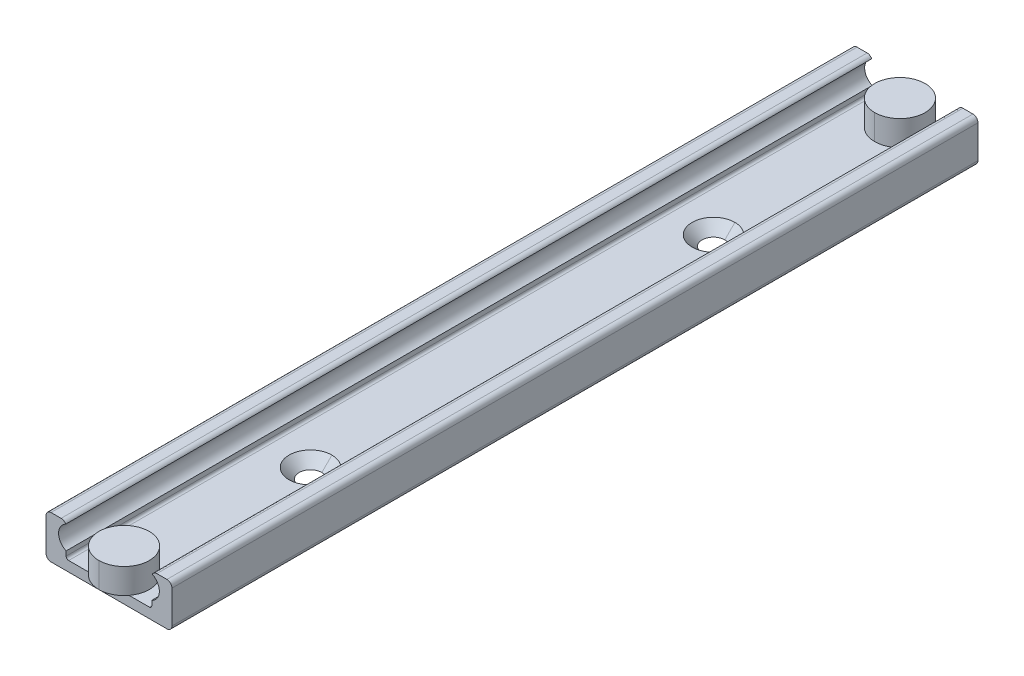
ISO-10303-21;
HEADER;
FILE_DESCRIPTION(('STEP AP214'),'2;1');
FILE_NAME('part.step','',(''),(''),'','','');
FILE_SCHEMA(('AUTOMOTIVE_DESIGN { 1 0 10303 214 1 1 1 1 }'));
ENDSEC;
DATA;
#1=APPLICATION_CONTEXT('core data for automotive mechanical design processes');
#2=APPLICATION_PROTOCOL_DEFINITION('international standard','automotive_design',2000,#1);
#3=PRODUCT_CONTEXT('',#1,'mechanical');
#4=PRODUCT('Part','Part','',(#3));
#5=PRODUCT_RELATED_PRODUCT_CATEGORY('part','',(#4));
#6=PRODUCT_DEFINITION_FORMATION('','',#4);
#7=PRODUCT_DEFINITION_CONTEXT('part definition',#1,'design');
#8=PRODUCT_DEFINITION('design','',#6,#7);
#9=PRODUCT_DEFINITION_SHAPE('','',#8);
#10=(LENGTH_UNIT() NAMED_UNIT(*) SI_UNIT(.MILLI.,.METRE.));
#11=(NAMED_UNIT(*) PLANE_ANGLE_UNIT() SI_UNIT($,.RADIAN.));
#12=(NAMED_UNIT(*) SI_UNIT($,.STERADIAN.) SOLID_ANGLE_UNIT());
#13=UNCERTAINTY_MEASURE_WITH_UNIT(LENGTH_MEASURE(1.E-05),#10,'distance_accuracy_value','');
#14=(GEOMETRIC_REPRESENTATION_CONTEXT(3) GLOBAL_UNCERTAINTY_ASSIGNED_CONTEXT((#13)) GLOBAL_UNIT_ASSIGNED_CONTEXT((#10,
#11,#12)) REPRESENTATION_CONTEXT('',''));
#15=CARTESIAN_POINT('',(0.,0.,0.));
#16=DIRECTION('',(0.,0.,1.));
#17=DIRECTION('',(1.,0.,0.));
#18=AXIS2_PLACEMENT_3D('',#15,#16,#17);
#19=CARTESIAN_POINT('',(-12.5,7.5,160.));
#20=DIRECTION('',(1.,0.,0.));
#21=DIRECTION('',(0.,0.,-1.));
#22=AXIS2_PLACEMENT_3D('',#19,#20,#21);
#23=PLANE('',#22);
#24=DIRECTION('',(0.,-1.,0.));
#25=VECTOR('',#24,1.);
#26=CARTESIAN_POINT('',(-12.5,7.5,0.));
#27=LINE('',#26,#25);
#28=CARTESIAN_POINT('',(-12.5,7.5,0.));
#29=VERTEX_POINT('',#28);
#30=CARTESIAN_POINT('',(-12.5,1.,0.));
#31=VERTEX_POINT('',#30);
#32=EDGE_CURVE('E11',#29,#31,#27,.T.);
#33=ORIENTED_EDGE('',*,*,#32,.T.);
#34=DIRECTION('',(0.,0.,-1.));
#35=VECTOR('',#34,1.);
#36=CARTESIAN_POINT('',(-12.5,1.,160.));
#37=LINE('',#36,#35);
#38=CARTESIAN_POINT('',(-12.5,1.,160.));
#39=VERTEX_POINT('',#38);
#40=EDGE_CURVE('E24',#39,#31,#37,.T.);
#41=ORIENTED_EDGE('',*,*,#40,.F.);
#42=DIRECTION('',(0.,-1.,0.));
#43=VECTOR('',#42,1.);
#44=CARTESIAN_POINT('',(-12.5,7.5,160.));
#45=LINE('',#44,#43);
#46=CARTESIAN_POINT('',(-12.5,7.5,160.));
#47=VERTEX_POINT('',#46);
#48=EDGE_CURVE('E581',#47,#39,#45,.T.);
#49=ORIENTED_EDGE('',*,*,#48,.F.);
#50=DIRECTION('',(0.,0.,-1.));
#51=VECTOR('',#50,1.);
#52=CARTESIAN_POINT('',(-12.5,7.5,160.));
#53=LINE('',#52,#51);
#54=EDGE_CURVE('E577',#47,#29,#53,.T.);
#55=ORIENTED_EDGE('',*,*,#54,.T.);
#56=EDGE_LOOP('',(#33,#41,#49,#55));
#57=FACE_BOUND('',#56,.T.);
#58=ADVANCED_FACE('F16',(#57),#23,.F.);
#59=CARTESIAN_POINT('',(-11.5000000000007,7.50000000000069,160.));
#60=DIRECTION('',(0.,0.,-1.));
#61=DIRECTION('',(0.707106781186161,-0.707106781186934,0.));
#62=AXIS2_PLACEMENT_3D('',#59,#60,#61);
#63=CYLINDRICAL_SURFACE('',#62,0.99999999999931);
#64=CARTESIAN_POINT('',(-11.5000000000007,7.50000000000069,0.));
#65=DIRECTION('',(0.,0.,1.));
#66=DIRECTION('',(1.,0.,0.));
#67=AXIS2_PLACEMENT_3D('',#64,#65,#66);
#68=CIRCLE('',#67,0.99999999999931);
#69=CARTESIAN_POINT('',(-11.5,8.5,0.));
#70=VERTEX_POINT('',#69);
#71=EDGE_CURVE('E572',#70,#29,#68,.T.);
#72=ORIENTED_EDGE('',*,*,#71,.T.);
#73=ORIENTED_EDGE('',*,*,#54,.F.);
#74=CARTESIAN_POINT('',(-11.5000000000007,7.50000000000069,160.));
#75=DIRECTION('',(0.,0.,1.));
#76=DIRECTION('',(1.,0.,0.));
#77=AXIS2_PLACEMENT_3D('',#74,#75,#76);
#78=CIRCLE('',#77,0.99999999999931);
#79=CARTESIAN_POINT('',(-11.5,8.5,160.));
#80=VERTEX_POINT('',#79);
#81=EDGE_CURVE('E567',#80,#47,#78,.T.);
#82=ORIENTED_EDGE('',*,*,#81,.F.);
#83=DIRECTION('',(0.,0.,-1.));
#84=VECTOR('',#83,1.);
#85=CARTESIAN_POINT('',(-11.5,8.5,160.));
#86=LINE('',#85,#84);
#87=EDGE_CURVE('E563',#80,#70,#86,.T.);
#88=ORIENTED_EDGE('',*,*,#87,.T.);
#89=EDGE_LOOP('',(#72,#73,#82,#88));
#90=FACE_BOUND('',#89,.T.);
#91=ADVANCED_FACE('F599',(#90),#63,.T.);
#92=CARTESIAN_POINT('',(-9.5,8.5,160.));
#93=DIRECTION('',(0.,-1.,0.));
#94=DIRECTION('',(0.,0.,-1.));
#95=AXIS2_PLACEMENT_3D('',#92,#93,#94);
#96=PLANE('',#95);
#97=DIRECTION('',(-1.,0.,0.));
#98=VECTOR('',#97,1.);
#99=CARTESIAN_POINT('',(-9.5,8.5,0.));
#100=LINE('',#99,#98);
#101=CARTESIAN_POINT('',(-9.5,8.5,0.));
#102=VERTEX_POINT('',#101);
#103=EDGE_CURVE('E558',#102,#70,#100,.T.);
#104=ORIENTED_EDGE('',*,*,#103,.T.);
#105=ORIENTED_EDGE('',*,*,#87,.F.);
#106=DIRECTION('',(-1.,0.,0.));
#107=VECTOR('',#106,1.);
#108=CARTESIAN_POINT('',(-9.5,8.5,160.));
#109=LINE('',#108,#107);
#110=CARTESIAN_POINT('',(-9.5,8.5,160.));
#111=VERTEX_POINT('',#110);
#112=EDGE_CURVE('E553',#111,#80,#109,.T.);
#113=ORIENTED_EDGE('',*,*,#112,.F.);
#114=DIRECTION('',(0.,0.,-1.));
#115=VECTOR('',#114,1.);
#116=CARTESIAN_POINT('',(-9.5,8.5,160.));
#117=LINE('',#116,#115);
#118=EDGE_CURVE('E549',#111,#102,#117,.T.);
#119=ORIENTED_EDGE('',*,*,#118,.T.);
#120=EDGE_LOOP('',(#104,#105,#113,#119));
#121=FACE_BOUND('',#120,.T.);
#122=ADVANCED_FACE('F677',(#121),#96,.F.);
#123=CARTESIAN_POINT('',(-9.5,7.5,160.));
#124=DIRECTION('',(0.,0.,-1.));
#125=DIRECTION('',(-0.52762171224576,-0.849479445758902,0.));
#126=AXIS2_PLACEMENT_3D('',#123,#124,#125);
#127=CYLINDRICAL_SURFACE('',#126,1.);
#128=CARTESIAN_POINT('',(-9.5,7.5,0.));
#129=DIRECTION('',(0.,0.,1.));
#130=DIRECTION('',(1.,0.,0.));
#131=AXIS2_PLACEMENT_3D('',#128,#129,#130);
#132=CIRCLE('',#131,1.);
#133=CARTESIAN_POINT('',(-8.6035924033162,7.943230662982,0.));
#134=VERTEX_POINT('',#133);
#135=EDGE_CURVE('E544',#134,#102,#132,.T.);
#136=ORIENTED_EDGE('',*,*,#135,.T.);
#137=ORIENTED_EDGE('',*,*,#118,.F.);
#138=CARTESIAN_POINT('',(-9.5,7.5,160.));
#139=DIRECTION('',(0.,0.,1.));
#140=DIRECTION('',(1.,0.,0.));
#141=AXIS2_PLACEMENT_3D('',#138,#139,#140);
#142=CIRCLE('',#141,1.);
#143=CARTESIAN_POINT('',(-8.6035924033162,7.943230662982,160.));
#144=VERTEX_POINT('',#143);
#145=EDGE_CURVE('E539',#144,#111,#142,.T.);
#146=ORIENTED_EDGE('',*,*,#145,.F.);
#147=DIRECTION('',(0.,0.,-1.));
#148=VECTOR('',#147,1.);
#149=CARTESIAN_POINT('',(-8.6035924033162,7.943230662982,160.));
#150=LINE('',#149,#148);
#151=EDGE_CURVE('E535',#144,#134,#150,.T.);
#152=ORIENTED_EDGE('',*,*,#151,.T.);
#153=EDGE_LOOP('',(#136,#137,#146,#152));
#154=FACE_BOUND('',#153,.T.);
#155=ADVANCED_FACE('F681',(#154),#127,.T.);
#156=CARTESIAN_POINT('',(-7.5,5.7,160.));
#157=DIRECTION('',(0.,0.,-1.));
#158=DIRECTION('',(0.999739148561569,0.022839326465319,0.));
#159=AXIS2_PLACEMENT_3D('',#156,#157,#158);
#160=CYLINDRICAL_SURFACE('',#159,2.5);
#161=CARTESIAN_POINT('',(-7.5,5.7,0.));
#162=DIRECTION('',(0.,0.,1.));
#163=DIRECTION('',(1.,0.,0.));
#164=AXIS2_PLACEMENT_3D('',#161,#162,#163);
#165=CIRCLE('',#164,2.5);
#166=CARTESIAN_POINT('',(-8.5,3.4087121525221,0.));
#167=VERTEX_POINT('',#166);
#168=EDGE_CURVE('E530',#134,#167,#165,.T.);
#169=ORIENTED_EDGE('',*,*,#168,.F.);
#170=ORIENTED_EDGE('',*,*,#151,.F.);
#171=CARTESIAN_POINT('',(-7.5,5.7,160.));
#172=DIRECTION('',(0.,0.,1.));
#173=DIRECTION('',(1.,0.,0.));
#174=AXIS2_PLACEMENT_3D('',#171,#172,#173);
#175=CIRCLE('',#174,2.5);
#176=CARTESIAN_POINT('',(-8.5,3.4087121525221,160.));
#177=VERTEX_POINT('',#176);
#178=EDGE_CURVE('E526',#144,#177,#175,.T.);
#179=ORIENTED_EDGE('',*,*,#178,.T.);
#180=DIRECTION('',(0.,0.,-1.));
#181=VECTOR('',#180,1.);
#182=CARTESIAN_POINT('',(-8.5,3.4087121525221,160.));
#183=LINE('',#182,#181);
#184=EDGE_CURVE('E522',#177,#167,#183,.T.);
#185=ORIENTED_EDGE('',*,*,#184,.T.);
#186=EDGE_LOOP('',(#169,#170,#179,#185));
#187=FACE_BOUND('',#186,.T.);
#188=ADVANCED_FACE('F687',(#187),#160,.F.);
#189=CARTESIAN_POINT('',(-8.5,2.5,160.));
#190=DIRECTION('',(-1.,0.,0.));
#191=DIRECTION('',(0.,0.,1.));
#192=AXIS2_PLACEMENT_3D('',#189,#190,#191);
#193=PLANE('',#192);
#194=DIRECTION('',(0.,1.,0.));
#195=VECTOR('',#194,1.);
#196=CARTESIAN_POINT('',(-8.5,2.5,0.));
#197=LINE('',#196,#195);
#198=CARTESIAN_POINT('',(-8.5,2.5,0.));
#199=VERTEX_POINT('',#198);
#200=EDGE_CURVE('E517',#199,#167,#197,.T.);
#201=ORIENTED_EDGE('',*,*,#200,.T.);
#202=ORIENTED_EDGE('',*,*,#184,.F.);
#203=DIRECTION('',(0.,1.,0.));
#204=VECTOR('',#203,1.);
#205=CARTESIAN_POINT('',(-8.5,2.5,160.));
#206=LINE('',#205,#204);
#207=CARTESIAN_POINT('',(-8.5,2.5,160.));
#208=VERTEX_POINT('',#207);
#209=EDGE_CURVE('E512',#208,#177,#206,.T.);
#210=ORIENTED_EDGE('',*,*,#209,.F.);
#211=DIRECTION('',(0.,0.,-1.));
#212=VECTOR('',#211,1.);
#213=CARTESIAN_POINT('',(-8.5,2.5,160.));
#214=LINE('',#213,#212);
#215=EDGE_CURVE('E508',#208,#199,#214,.T.);
#216=ORIENTED_EDGE('',*,*,#215,.T.);
#217=EDGE_LOOP('',(#201,#202,#210,#216));
#218=FACE_BOUND('',#217,.T.);
#219=ADVANCED_FACE('F691',(#218),#193,.F.);
#220=CARTESIAN_POINT('',(-8.00000000000009,2.49999999999991,160.));
#221=DIRECTION('',(0.,0.,-1.));
#222=DIRECTION('',(0.707106781186547,0.707106781186548,0.));
#223=AXIS2_PLACEMENT_3D('',#220,#221,#222);
#224=CYLINDRICAL_SURFACE('',#223,0.499999999999911);
#225=CARTESIAN_POINT('',(-8.00000000000009,2.49999999999991,0.));
#226=DIRECTION('',(0.,0.,1.));
#227=DIRECTION('',(1.,0.,0.));
#228=AXIS2_PLACEMENT_3D('',#225,#226,#227);
#229=CIRCLE('',#228,0.499999999999911);
#230=CARTESIAN_POINT('',(-8.,2.,0.));
#231=VERTEX_POINT('',#230);
#232=EDGE_CURVE('E503',#199,#231,#229,.T.);
#233=ORIENTED_EDGE('',*,*,#232,.F.);
#234=ORIENTED_EDGE('',*,*,#215,.F.);
#235=CARTESIAN_POINT('',(-8.00000000000009,2.49999999999991,160.));
#236=DIRECTION('',(0.,0.,1.));
#237=DIRECTION('',(1.,0.,0.));
#238=AXIS2_PLACEMENT_3D('',#235,#236,#237);
#239=CIRCLE('',#238,0.499999999999911);
#240=CARTESIAN_POINT('',(-8.,2.,160.));
#241=VERTEX_POINT('',#240);
#242=EDGE_CURVE('E499',#208,#241,#239,.T.);
#243=ORIENTED_EDGE('',*,*,#242,.T.);
#244=DIRECTION('',(0.,0.,-1.));
#245=VECTOR('',#244,1.);
#246=CARTESIAN_POINT('',(-8.,2.,160.));
#247=LINE('',#246,#245);
#248=EDGE_CURVE('E495',#241,#231,#247,.T.);
#249=ORIENTED_EDGE('',*,*,#248,.T.);
#250=EDGE_LOOP('',(#233,#234,#243,#249));
#251=FACE_BOUND('',#250,.T.);
#252=ADVANCED_FACE('F695',(#251),#224,.F.);
#253=CARTESIAN_POINT('',(8.,2.,160.));
#254=DIRECTION('',(0.,-1.,0.));
#255=DIRECTION('',(0.,0.,-1.));
#256=AXIS2_PLACEMENT_3D('',#253,#254,#255);
#257=PLANE('',#256);
#258=CARTESIAN_POINT('',(0.,2.,157.));
#259=DIRECTION('',(0.,1.,0.));
#260=DIRECTION('',(1.,0.,0.));
#261=AXIS2_PLACEMENT_3D('',#258,#259,#260);
#262=CIRCLE('',#261,5.);
#263=CARTESIAN_POINT('',(0.,2.,152.));
#264=VERTEX_POINT('',#263);
#265=CARTESIAN_POINT('',(-4.,2.,160.));
#266=VERTEX_POINT('',#265);
#267=EDGE_CURVE('E490',#264,#266,#262,.T.);
#268=ORIENTED_EDGE('',*,*,#267,.F.);
#269=CARTESIAN_POINT('',(0.,2.,157.));
#270=DIRECTION('',(0.,1.,0.));
#271=DIRECTION('',(1.,0.,0.));
#272=AXIS2_PLACEMENT_3D('',#269,#270,#271);
#273=CIRCLE('',#272,5.);
#274=CARTESIAN_POINT('',(4.,2.,160.));
#275=VERTEX_POINT('',#274);
#276=EDGE_CURVE('E485',#275,#264,#273,.T.);
#277=ORIENTED_EDGE('',*,*,#276,.F.);
#278=DIRECTION('',(-1.,0.,0.));
#279=VECTOR('',#278,1.);
#280=CARTESIAN_POINT('',(8.,2.,160.));
#281=LINE('',#280,#279);
#282=CARTESIAN_POINT('',(8.,2.,160.));
#283=VERTEX_POINT('',#282);
#284=EDGE_CURVE('E480',#283,#275,#281,.T.);
#285=ORIENTED_EDGE('',*,*,#284,.F.);
#286=DIRECTION('',(0.,0.,-1.));
#287=VECTOR('',#286,1.);
#288=CARTESIAN_POINT('',(8.,2.,160.));
#289=LINE('',#288,#287);
#290=CARTESIAN_POINT('',(8.,2.,0.));
#291=VERTEX_POINT('',#290);
#292=EDGE_CURVE('E476',#283,#291,#289,.T.);
#293=ORIENTED_EDGE('',*,*,#292,.T.);
#294=DIRECTION('',(-1.,0.,0.));
#295=VECTOR('',#294,1.);
#296=CARTESIAN_POINT('',(8.,2.,0.));
#297=LINE('',#296,#295);
#298=CARTESIAN_POINT('',(4.,2.,0.));
#299=VERTEX_POINT('',#298);
#300=EDGE_CURVE('E472',#291,#299,#297,.T.);
#301=ORIENTED_EDGE('',*,*,#300,.T.);
#302=CARTESIAN_POINT('',(0.,2.,3.));
#303=DIRECTION('',(0.,1.,0.));
#304=DIRECTION('',(1.,0.,0.));
#305=AXIS2_PLACEMENT_3D('',#302,#303,#304);
#306=CIRCLE('',#305,5.);
#307=CARTESIAN_POINT('',(0.,2.,8.));
#308=VERTEX_POINT('',#307);
#309=EDGE_CURVE('E468',#308,#299,#306,.T.);
#310=ORIENTED_EDGE('',*,*,#309,.F.);
#311=CARTESIAN_POINT('',(0.,2.,3.));
#312=DIRECTION('',(0.,1.,0.));
#313=DIRECTION('',(1.,0.,0.));
#314=AXIS2_PLACEMENT_3D('',#311,#312,#313);
#315=CIRCLE('',#314,5.);
#316=CARTESIAN_POINT('',(-4.,2.,0.));
#317=VERTEX_POINT('',#316);
#318=EDGE_CURVE('E214',#317,#308,#315,.T.);
#319=ORIENTED_EDGE('',*,*,#318,.F.);
#320=DIRECTION('',(-1.,0.,0.));
#321=VECTOR('',#320,1.);
#322=CARTESIAN_POINT('',(8.,2.,0.));
#323=LINE('',#322,#321);
#324=EDGE_CURVE('E460',#317,#231,#323,.T.);
#325=ORIENTED_EDGE('',*,*,#324,.T.);
#326=ORIENTED_EDGE('',*,*,#248,.F.);
#327=DIRECTION('',(-1.,0.,0.));
#328=VECTOR('',#327,1.);
#329=CARTESIAN_POINT('',(8.,2.,160.));
#330=LINE('',#329,#328);
#331=EDGE_CURVE('E455',#266,#241,#330,.T.);
#332=ORIENTED_EDGE('',*,*,#331,.F.);
#333=EDGE_LOOP('',(#268,#277,#285,#293,#301,#310,#319,#325,#326,#332));
#334=FACE_BOUND('',#333,.T.);
#335=CARTESIAN_POINT('',(0.,2.,120.));
#336=DIRECTION('',(0.,-1.,0.));
#337=DIRECTION('',(0.,0.,-1.));
#338=AXIS2_PLACEMENT_3D('',#335,#336,#337);
#339=CIRCLE('',#338,4.25);
#340=CARTESIAN_POINT('',(0.,2.,115.75));
#341=VERTEX_POINT('',#340);
#342=CARTESIAN_POINT('',(0.,2.,124.25));
#343=VERTEX_POINT('',#342);
#344=EDGE_CURVE('E451',#341,#343,#339,.T.);
#345=ORIENTED_EDGE('',*,*,#344,.T.);
#346=CARTESIAN_POINT('',(0.,2.,120.));
#347=DIRECTION('',(0.,-1.,0.));
#348=DIRECTION('',(0.,0.,-1.));
#349=AXIS2_PLACEMENT_3D('',#346,#347,#348);
#350=CIRCLE('',#349,4.25);
#351=EDGE_CURVE('E447',#343,#341,#350,.T.);
#352=ORIENTED_EDGE('',*,*,#351,.T.);
#353=EDGE_LOOP('',(#345,#352));
#354=FACE_BOUND('',#353,.T.);
#355=CARTESIAN_POINT('',(0.,2.,40.));
#356=DIRECTION('',(0.,-1.,0.));
#357=DIRECTION('',(0.,0.,-1.));
#358=AXIS2_PLACEMENT_3D('',#355,#356,#357);
#359=CIRCLE('',#358,4.25);
#360=CARTESIAN_POINT('',(0.,2.,35.75));
#361=VERTEX_POINT('',#360);
#362=CARTESIAN_POINT('',(0.,2.,44.25));
#363=VERTEX_POINT('',#362);
#364=EDGE_CURVE('E443',#361,#363,#359,.T.);
#365=ORIENTED_EDGE('',*,*,#364,.T.);
#366=CARTESIAN_POINT('',(0.,2.,40.));
#367=DIRECTION('',(0.,-1.,0.));
#368=DIRECTION('',(0.,0.,-1.));
#369=AXIS2_PLACEMENT_3D('',#366,#367,#368);
#370=CIRCLE('',#369,4.25);
#371=EDGE_CURVE('E439',#363,#361,#370,.T.);
#372=ORIENTED_EDGE('',*,*,#371,.T.);
#373=EDGE_LOOP('',(#365,#372));
#374=FACE_BOUND('',#373,.T.);
#375=ADVANCED_FACE('F647',(#334,#354,#374),#257,.F.);
#376=CARTESIAN_POINT('',(0.,2.,40.));
#377=DIRECTION('',(0.,1.,0.));
#378=DIRECTION('',(1.,0.,0.));
#379=AXIS2_PLACEMENT_3D('',#376,#377,#378);
#380=CONICAL_SURFACE('',#379,4.25,0.785398163397448);
#381=DIRECTION('',(0.,0.707106781186547,-0.707106781186548));
#382=VECTOR('',#381,1.);
#383=CARTESIAN_POINT('',(0.,0.,37.75));
#384=LINE('',#383,#382);
#385=CARTESIAN_POINT('',(0.,0.,37.75));
#386=VERTEX_POINT('',#385);
#387=EDGE_CURVE('E434',#386,#361,#384,.T.);
#388=ORIENTED_EDGE('',*,*,#387,.T.);
#389=ORIENTED_EDGE('',*,*,#371,.F.);
#390=DIRECTION('',(0.,0.707106781186547,0.707106781186548));
#391=VECTOR('',#390,1.);
#392=CARTESIAN_POINT('',(0.,0.,42.25));
#393=LINE('',#392,#391);
#394=CARTESIAN_POINT('',(0.,0.,42.25));
#395=VERTEX_POINT('',#394);
#396=EDGE_CURVE('E429',#395,#363,#393,.T.);
#397=ORIENTED_EDGE('',*,*,#396,.F.);
#398=CARTESIAN_POINT('',(0.,0.,40.));
#399=DIRECTION('',(0.,-1.,0.));
#400=DIRECTION('',(0.,0.,-1.));
#401=AXIS2_PLACEMENT_3D('',#398,#399,#400);
#402=CIRCLE('',#401,2.25);
#403=EDGE_CURVE('E425',#395,#386,#402,.T.);
#404=ORIENTED_EDGE('',*,*,#403,.T.);
#405=EDGE_LOOP('',(#388,#389,#397,#404));
#406=FACE_BOUND('',#405,.T.);
#407=ADVANCED_FACE('F702',(#406),#380,.F.);
#408=CARTESIAN_POINT('',(-11.5,0.,160.));
#409=DIRECTION('',(0.,1.,0.));
#410=DIRECTION('',(0.,0.,1.));
#411=AXIS2_PLACEMENT_3D('',#408,#409,#410);
#412=PLANE('',#411);
#413=CARTESIAN_POINT('',(0.,0.,120.));
#414=DIRECTION('',(0.,-1.,0.));
#415=DIRECTION('',(0.,0.,-1.));
#416=AXIS2_PLACEMENT_3D('',#413,#414,#415);
#417=CIRCLE('',#416,2.25);
#418=CARTESIAN_POINT('',(0.,0.,122.25));
#419=VERTEX_POINT('',#418);
#420=CARTESIAN_POINT('',(0.,0.,117.75));
#421=VERTEX_POINT('',#420);
#422=EDGE_CURVE('E420',#419,#421,#417,.T.);
#423=ORIENTED_EDGE('',*,*,#422,.F.);
#424=CARTESIAN_POINT('',(0.,0.,120.));
#425=DIRECTION('',(0.,-1.,0.));
#426=DIRECTION('',(0.,0.,-1.));
#427=AXIS2_PLACEMENT_3D('',#424,#425,#426);
#428=CIRCLE('',#427,2.25);
#429=EDGE_CURVE('E415',#421,#419,#428,.T.);
#430=ORIENTED_EDGE('',*,*,#429,.F.);
#431=EDGE_LOOP('',(#423,#430));
#432=FACE_BOUND('',#431,.T.);
#433=ORIENTED_EDGE('',*,*,#403,.F.);
#434=CARTESIAN_POINT('',(0.,0.,40.));
#435=DIRECTION('',(0.,-1.,0.));
#436=DIRECTION('',(0.,0.,-1.));
#437=AXIS2_PLACEMENT_3D('',#434,#435,#436);
#438=CIRCLE('',#437,2.25);
#439=EDGE_CURVE('E410',#386,#395,#438,.T.);
#440=ORIENTED_EDGE('',*,*,#439,.F.);
#441=EDGE_LOOP('',(#433,#440));
#442=FACE_BOUND('',#441,.T.);
#443=DIRECTION('',(1.,0.,0.));
#444=VECTOR('',#443,1.);
#445=CARTESIAN_POINT('',(-11.5,0.,0.));
#446=LINE('',#445,#444);
#447=CARTESIAN_POINT('',(-11.5,0.,0.));
#448=VERTEX_POINT('',#447);
#449=CARTESIAN_POINT('',(11.5,0.,0.));
#450=VERTEX_POINT('',#449);
#451=EDGE_CURVE('E406',#448,#450,#446,.T.);
#452=ORIENTED_EDGE('',*,*,#451,.T.);
#453=DIRECTION('',(0.,0.,-1.));
#454=VECTOR('',#453,1.);
#455=CARTESIAN_POINT('',(11.5,0.,160.));
#456=LINE('',#455,#454);
#457=CARTESIAN_POINT('',(11.5,0.,160.));
#458=VERTEX_POINT('',#457);
#459=EDGE_CURVE('E401',#458,#450,#456,.T.);
#460=ORIENTED_EDGE('',*,*,#459,.F.);
#461=DIRECTION('',(1.,0.,0.));
#462=VECTOR('',#461,1.);
#463=CARTESIAN_POINT('',(-11.5,0.,160.));
#464=LINE('',#463,#462);
#465=CARTESIAN_POINT('',(-11.5,0.,160.));
#466=VERTEX_POINT('',#465);
#467=EDGE_CURVE('E396',#466,#458,#464,.T.);
#468=ORIENTED_EDGE('',*,*,#467,.F.);
#469=DIRECTION('',(0.,0.,-1.));
#470=VECTOR('',#469,1.);
#471=CARTESIAN_POINT('',(-11.5,0.,160.));
#472=LINE('',#471,#470);
#473=EDGE_CURVE('E392',#466,#448,#472,.T.);
#474=ORIENTED_EDGE('',*,*,#473,.T.);
#475=EDGE_LOOP('',(#452,#460,#468,#474));
#476=FACE_BOUND('',#475,.T.);
#477=ADVANCED_FACE('F607',(#432,#442,#476),#412,.F.);
#478=CARTESIAN_POINT('',(-11.5000000000008,0.999999999999223,160.));
#479=DIRECTION('',(0.,0.,-1.));
#480=DIRECTION('',(0.707106781186115,0.70710678118698,0.));
#481=AXIS2_PLACEMENT_3D('',#478,#479,#480);
#482=CYLINDRICAL_SURFACE('',#481,0.999999999999222);
#483=CARTESIAN_POINT('',(-11.5000000000008,0.999999999999223,0.));
#484=DIRECTION('',(0.,0.,1.));
#485=DIRECTION('',(1.,0.,0.));
#486=AXIS2_PLACEMENT_3D('',#483,#484,#485);
#487=CIRCLE('',#486,0.999999999999222);
#488=EDGE_CURVE('E387',#31,#448,#487,.T.);
#489=ORIENTED_EDGE('',*,*,#488,.T.);
#490=ORIENTED_EDGE('',*,*,#473,.F.);
#491=CARTESIAN_POINT('',(-11.5000000000008,0.999999999999223,160.));
#492=DIRECTION('',(0.,0.,1.));
#493=DIRECTION('',(1.,0.,0.));
#494=AXIS2_PLACEMENT_3D('',#491,#492,#493);
#495=CIRCLE('',#494,0.999999999999222);
#496=EDGE_CURVE('E382',#39,#466,#495,.T.);
#497=ORIENTED_EDGE('',*,*,#496,.F.);
#498=ORIENTED_EDGE('',*,*,#40,.T.);
#499=EDGE_LOOP('',(#489,#490,#497,#498));
#500=FACE_BOUND('',#499,.T.);
#501=ADVANCED_FACE('F591',(#500),#482,.T.);
#502=CARTESIAN_POINT('',(-11.5000000000008,0.999999999999223,160.));
#503=DIRECTION('',(0.,0.,1.));
#504=DIRECTION('',(1.,0.,0.));
#505=AXIS2_PLACEMENT_3D('',#502,#503,#504);
#506=PLANE('',#505);
#507=ORIENTED_EDGE('',*,*,#48,.T.);
#508=ORIENTED_EDGE('',*,*,#496,.T.);
#509=ORIENTED_EDGE('',*,*,#467,.T.);
#510=CARTESIAN_POINT('',(11.5000000000008,0.999999999999223,160.));
#511=DIRECTION('',(0.,0.,1.));
#512=DIRECTION('',(1.,0.,0.));
#513=AXIS2_PLACEMENT_3D('',#510,#511,#512);
#514=CIRCLE('',#513,0.999999999999223);
#515=CARTESIAN_POINT('',(12.5,1.,160.));
#516=VERTEX_POINT('',#515);
#517=EDGE_CURVE('E378',#458,#516,#514,.T.);
#518=ORIENTED_EDGE('',*,*,#517,.T.);
#519=DIRECTION('',(0.,1.,0.));
#520=VECTOR('',#519,1.);
#521=CARTESIAN_POINT('',(12.5,1.,160.));
#522=LINE('',#521,#520);
#523=CARTESIAN_POINT('',(12.5,7.5,160.));
#524=VERTEX_POINT('',#523);
#525=EDGE_CURVE('E374',#516,#524,#522,.T.);
#526=ORIENTED_EDGE('',*,*,#525,.T.);
#527=CARTESIAN_POINT('',(11.5000000000007,7.50000000000069,160.));
#528=DIRECTION('',(0.,0.,1.));
#529=DIRECTION('',(1.,0.,0.));
#530=AXIS2_PLACEMENT_3D('',#527,#528,#529);
#531=CIRCLE('',#530,0.999999999999309);
#532=CARTESIAN_POINT('',(11.5,8.5,160.));
#533=VERTEX_POINT('',#532);
#534=EDGE_CURVE('E370',#524,#533,#531,.T.);
#535=ORIENTED_EDGE('',*,*,#534,.T.);
#536=DIRECTION('',(-1.,0.,0.));
#537=VECTOR('',#536,1.);
#538=CARTESIAN_POINT('',(11.5,8.5,160.));
#539=LINE('',#538,#537);
#540=CARTESIAN_POINT('',(9.5,8.5,160.));
#541=VERTEX_POINT('',#540);
#542=EDGE_CURVE('E366',#533,#541,#539,.T.);
#543=ORIENTED_EDGE('',*,*,#542,.T.);
#544=CARTESIAN_POINT('',(9.5,7.5,160.));
#545=DIRECTION('',(0.,0.,1.));
#546=DIRECTION('',(1.,0.,0.));
#547=AXIS2_PLACEMENT_3D('',#544,#545,#546);
#548=CIRCLE('',#547,1.);
#549=CARTESIAN_POINT('',(8.6035924033162,7.943230662982,160.));
#550=VERTEX_POINT('',#549);
#551=EDGE_CURVE('E362',#541,#550,#548,.T.);
#552=ORIENTED_EDGE('',*,*,#551,.T.);
#553=CARTESIAN_POINT('',(7.5,5.7,160.));
#554=DIRECTION('',(0.,0.,1.));
#555=DIRECTION('',(1.,0.,0.));
#556=AXIS2_PLACEMENT_3D('',#553,#554,#555);
#557=CIRCLE('',#556,2.5);
#558=CARTESIAN_POINT('',(8.5,3.4087121525221,160.));
#559=VERTEX_POINT('',#558);
#560=EDGE_CURVE('E357',#559,#550,#557,.T.);
#561=ORIENTED_EDGE('',*,*,#560,.F.);
#562=DIRECTION('',(0.,-1.,0.));
#563=VECTOR('',#562,1.);
#564=CARTESIAN_POINT('',(8.5,3.4087121525221,160.));
#565=LINE('',#564,#563);
#566=CARTESIAN_POINT('',(8.5,2.5,160.));
#567=VERTEX_POINT('',#566);
#568=EDGE_CURVE('E353',#559,#567,#565,.T.);
#569=ORIENTED_EDGE('',*,*,#568,.T.);
#570=CARTESIAN_POINT('',(8.00000000000009,2.49999999999991,160.));
#571=DIRECTION('',(0.,0.,1.));
#572=DIRECTION('',(1.,0.,0.));
#573=AXIS2_PLACEMENT_3D('',#570,#571,#572);
#574=CIRCLE('',#573,0.49999999999991);
#575=EDGE_CURVE('E348',#283,#567,#574,.T.);
#576=ORIENTED_EDGE('',*,*,#575,.F.);
#577=ORIENTED_EDGE('',*,*,#284,.T.);
#578=DIRECTION('',(-1.,0.,0.));
#579=VECTOR('',#578,1.);
#580=CARTESIAN_POINT('',(8.,2.,160.));
#581=LINE('',#580,#579);
#582=EDGE_CURVE('E343',#275,#266,#581,.T.);
#583=ORIENTED_EDGE('',*,*,#582,.T.);
#584=ORIENTED_EDGE('',*,*,#331,.T.);
#585=ORIENTED_EDGE('',*,*,#242,.F.);
#586=ORIENTED_EDGE('',*,*,#209,.T.);
#587=ORIENTED_EDGE('',*,*,#178,.F.);
#588=ORIENTED_EDGE('',*,*,#145,.T.);
#589=ORIENTED_EDGE('',*,*,#112,.T.);
#590=ORIENTED_EDGE('',*,*,#81,.T.);
#591=EDGE_LOOP('',(#507,#508,#509,#518,#526,#535,#543,#552,#561,#569,#576,#577,#583,#584,#585,
#586,#587,#588,#589,#590));
#592=FACE_BOUND('',#591,.T.);
#593=ADVANCED_FACE('F595',(#592),#506,.T.);
#594=CARTESIAN_POINT('',(0.,2.,157.));
#595=DIRECTION('',(0.,1.,0.));
#596=DIRECTION('',(0.,0.,1.));
#597=AXIS2_PLACEMENT_3D('',#594,#595,#596);
#598=PLANE('',#597);
#599=ORIENTED_EDGE('',*,*,#582,.F.);
#600=CARTESIAN_POINT('',(0.,2.,157.));
#601=DIRECTION('',(0.,1.,0.));
#602=DIRECTION('',(1.,0.,0.));
#603=AXIS2_PLACEMENT_3D('',#600,#601,#602);
#604=CIRCLE('',#603,5.);
#605=CARTESIAN_POINT('',(0.,2.,162.));
#606=VERTEX_POINT('',#605);
#607=EDGE_CURVE('E338',#606,#275,#604,.T.);
#608=ORIENTED_EDGE('',*,*,#607,.F.);
#609=CARTESIAN_POINT('',(0.,2.,157.));
#610=DIRECTION('',(0.,1.,0.));
#611=DIRECTION('',(1.,0.,0.));
#612=AXIS2_PLACEMENT_3D('',#609,#610,#611);
#613=CIRCLE('',#612,5.);
#614=EDGE_CURVE('E333',#266,#606,#613,.T.);
#615=ORIENTED_EDGE('',*,*,#614,.F.);
#616=EDGE_LOOP('',(#599,#608,#615));
#617=FACE_BOUND('',#616,.T.);
#618=ADVANCED_FACE('F658',(#617),#598,.F.);
#619=CARTESIAN_POINT('',(0.,7.,157.));
#620=DIRECTION('',(0.,-1.,0.));
#621=DIRECTION('',(1.,0.,0.));
#622=AXIS2_PLACEMENT_3D('',#619,#620,#621);
#623=CYLINDRICAL_SURFACE('',#622,5.);
#624=DIRECTION('',(0.,-1.,0.));
#625=VECTOR('',#624,1.);
#626=CARTESIAN_POINT('',(0.,7.,162.));
#627=LINE('',#626,#625);
#628=CARTESIAN_POINT('',(0.,7.,162.));
#629=VERTEX_POINT('',#628);
#630=EDGE_CURVE('E328',#629,#606,#627,.T.);
#631=ORIENTED_EDGE('',*,*,#630,.F.);
#632=CARTESIAN_POINT('',(0.,7.,157.));
#633=DIRECTION('',(0.,1.,0.));
#634=DIRECTION('',(1.,0.,0.));
#635=AXIS2_PLACEMENT_3D('',#632,#633,#634);
#636=CIRCLE('',#635,5.);
#637=CARTESIAN_POINT('',(0.,7.,152.));
#638=VERTEX_POINT('',#637);
#639=EDGE_CURVE('E323',#638,#629,#636,.T.);
#640=ORIENTED_EDGE('',*,*,#639,.F.);
#641=DIRECTION('',(0.,-1.,0.));
#642=VECTOR('',#641,1.);
#643=CARTESIAN_POINT('',(0.,7.,152.));
#644=LINE('',#643,#642);
#645=EDGE_CURVE('E318',#638,#264,#644,.T.);
#646=ORIENTED_EDGE('',*,*,#645,.T.);
#647=ORIENTED_EDGE('',*,*,#267,.T.);
#648=ORIENTED_EDGE('',*,*,#614,.T.);
#649=EDGE_LOOP('',(#631,#640,#646,#647,#648));
#650=FACE_BOUND('',#649,.T.);
#651=ADVANCED_FACE('F656',(#650),#623,.T.);
#652=CARTESIAN_POINT('',(0.,7.,157.));
#653=DIRECTION('',(0.,-1.,0.));
#654=DIRECTION('',(-1.,0.,0.));
#655=AXIS2_PLACEMENT_3D('',#652,#653,#654);
#656=CYLINDRICAL_SURFACE('',#655,5.);
#657=ORIENTED_EDGE('',*,*,#630,.T.);
#658=ORIENTED_EDGE('',*,*,#607,.T.);
#659=ORIENTED_EDGE('',*,*,#276,.T.);
#660=ORIENTED_EDGE('',*,*,#645,.F.);
#661=CARTESIAN_POINT('',(0.,7.,157.));
#662=DIRECTION('',(0.,1.,0.));
#663=DIRECTION('',(0.,0.,1.));
#664=AXIS2_PLACEMENT_3D('',#661,#662,#663);
#665=CIRCLE('',#664,5.);
#666=EDGE_CURVE('E313',#629,#638,#665,.T.);
#667=ORIENTED_EDGE('',*,*,#666,.F.);
#668=EDGE_LOOP('',(#657,#658,#659,#660,#667));
#669=FACE_BOUND('',#668,.T.);
#670=ADVANCED_FACE('F661',(#669),#656,.T.);
#671=CARTESIAN_POINT('',(0.,7.,157.));
#672=DIRECTION('',(0.,1.,0.));
#673=DIRECTION('',(0.,0.,1.));
#674=AXIS2_PLACEMENT_3D('',#671,#672,#673);
#675=PLANE('',#674);
#676=ORIENTED_EDGE('',*,*,#666,.T.);
#677=ORIENTED_EDGE('',*,*,#639,.T.);
#678=EDGE_LOOP('',(#676,#677));
#679=FACE_BOUND('',#678,.T.);
#680=ADVANCED_FACE('F663',(#679),#675,.T.);
#681=CARTESIAN_POINT('',(8.00000000000009,2.49999999999991,160.));
#682=DIRECTION('',(0.,0.,-1.));
#683=DIRECTION('',(-0.707106781186547,0.707106781186548,0.));
#684=AXIS2_PLACEMENT_3D('',#681,#682,#683);
#685=CYLINDRICAL_SURFACE('',#684,0.49999999999991);
#686=CARTESIAN_POINT('',(8.00000000000009,2.49999999999991,0.));
#687=DIRECTION('',(0.,0.,1.));
#688=DIRECTION('',(1.,0.,0.));
#689=AXIS2_PLACEMENT_3D('',#686,#687,#688);
#690=CIRCLE('',#689,0.49999999999991);
#691=CARTESIAN_POINT('',(8.5,2.5,0.));
#692=VERTEX_POINT('',#691);
#693=EDGE_CURVE('E308',#291,#692,#690,.T.);
#694=ORIENTED_EDGE('',*,*,#693,.F.);
#695=ORIENTED_EDGE('',*,*,#292,.F.);
#696=ORIENTED_EDGE('',*,*,#575,.T.);
#697=DIRECTION('',(0.,0.,-1.));
#698=VECTOR('',#697,1.);
#699=CARTESIAN_POINT('',(8.5,2.5,160.));
#700=LINE('',#699,#698);
#701=EDGE_CURVE('E304',#567,#692,#700,.T.);
#702=ORIENTED_EDGE('',*,*,#701,.T.);
#703=EDGE_LOOP('',(#694,#695,#696,#702));
#704=FACE_BOUND('',#703,.T.);
#705=ADVANCED_FACE('F644',(#704),#685,.F.);
#706=CARTESIAN_POINT('',(8.5,3.4087121525221,160.));
#707=DIRECTION('',(1.,0.,0.));
#708=DIRECTION('',(0.,0.,-1.));
#709=AXIS2_PLACEMENT_3D('',#706,#707,#708);
#710=PLANE('',#709);
#711=DIRECTION('',(0.,-1.,0.));
#712=VECTOR('',#711,1.);
#713=CARTESIAN_POINT('',(8.5,3.4087121525221,0.));
#714=LINE('',#713,#712);
#715=CARTESIAN_POINT('',(8.5,3.4087121525221,0.));
#716=VERTEX_POINT('',#715);
#717=EDGE_CURVE('E299',#716,#692,#714,.T.);
#718=ORIENTED_EDGE('',*,*,#717,.T.);
#719=ORIENTED_EDGE('',*,*,#701,.F.);
#720=ORIENTED_EDGE('',*,*,#568,.F.);
#721=DIRECTION('',(0.,0.,-1.));
#722=VECTOR('',#721,1.);
#723=CARTESIAN_POINT('',(8.5,3.4087121525221,160.));
#724=LINE('',#723,#722);
#725=EDGE_CURVE('E295',#559,#716,#724,.T.);
#726=ORIENTED_EDGE('',*,*,#725,.T.);
#727=EDGE_LOOP('',(#718,#719,#720,#726));
#728=FACE_BOUND('',#727,.T.);
#729=ADVANCED_FACE('F640',(#728),#710,.F.);
#730=CARTESIAN_POINT('',(7.5,5.7,160.));
#731=DIRECTION('',(0.,0.,-1.));
#732=DIRECTION('',(-0.999739148561569,0.0228393264653192,0.));
#733=AXIS2_PLACEMENT_3D('',#730,#731,#732);
#734=CYLINDRICAL_SURFACE('',#733,2.5);
#735=CARTESIAN_POINT('',(7.5,5.7,0.));
#736=DIRECTION('',(0.,0.,1.));
#737=DIRECTION('',(1.,0.,0.));
#738=AXIS2_PLACEMENT_3D('',#735,#736,#737);
#739=CIRCLE('',#738,2.5);
#740=CARTESIAN_POINT('',(8.6035924033162,7.943230662982,0.));
#741=VERTEX_POINT('',#740);
#742=EDGE_CURVE('E290',#716,#741,#739,.T.);
#743=ORIENTED_EDGE('',*,*,#742,.F.);
#744=ORIENTED_EDGE('',*,*,#725,.F.);
#745=ORIENTED_EDGE('',*,*,#560,.T.);
#746=DIRECTION('',(0.,0.,-1.));
#747=VECTOR('',#746,1.);
#748=CARTESIAN_POINT('',(8.6035924033162,7.943230662982,160.));
#749=LINE('',#748,#747);
#750=EDGE_CURVE('E286',#550,#741,#749,.T.);
#751=ORIENTED_EDGE('',*,*,#750,.T.);
#752=EDGE_LOOP('',(#743,#744,#745,#751));
#753=FACE_BOUND('',#752,.T.);
#754=ADVANCED_FACE('F634',(#753),#734,.F.);
#755=CARTESIAN_POINT('',(9.5,7.5,160.));
#756=DIRECTION('',(0.,0.,-1.));
#757=DIRECTION('',(0.52762171224576,-0.849479445758902,0.));
#758=AXIS2_PLACEMENT_3D('',#755,#756,#757);
#759=CYLINDRICAL_SURFACE('',#758,1.);
#760=CARTESIAN_POINT('',(9.5,7.5,0.));
#761=DIRECTION('',(0.,0.,1.));
#762=DIRECTION('',(1.,0.,0.));
#763=AXIS2_PLACEMENT_3D('',#760,#761,#762);
#764=CIRCLE('',#763,1.);
#765=CARTESIAN_POINT('',(9.5,8.5,0.));
#766=VERTEX_POINT('',#765);
#767=EDGE_CURVE('E281',#766,#741,#764,.T.);
#768=ORIENTED_EDGE('',*,*,#767,.T.);
#769=ORIENTED_EDGE('',*,*,#750,.F.);
#770=ORIENTED_EDGE('',*,*,#551,.F.);
#771=DIRECTION('',(0.,0.,-1.));
#772=VECTOR('',#771,1.);
#773=CARTESIAN_POINT('',(9.5,8.5,160.));
#774=LINE('',#773,#772);
#775=EDGE_CURVE('E277',#541,#766,#774,.T.);
#776=ORIENTED_EDGE('',*,*,#775,.T.);
#777=EDGE_LOOP('',(#768,#769,#770,#776));
#778=FACE_BOUND('',#777,.T.);
#779=ADVANCED_FACE('F630',(#778),#759,.T.);
#780=CARTESIAN_POINT('',(11.5,8.5,160.));
#781=DIRECTION('',(0.,-1.,0.));
#782=DIRECTION('',(0.,0.,-1.));
#783=AXIS2_PLACEMENT_3D('',#780,#781,#782);
#784=PLANE('',#783);
#785=DIRECTION('',(-1.,0.,0.));
#786=VECTOR('',#785,1.);
#787=CARTESIAN_POINT('',(11.5,8.5,0.));
#788=LINE('',#787,#786);
#789=CARTESIAN_POINT('',(11.5,8.5,0.));
#790=VERTEX_POINT('',#789);
#791=EDGE_CURVE('E272',#790,#766,#788,.T.);
#792=ORIENTED_EDGE('',*,*,#791,.T.);
#793=ORIENTED_EDGE('',*,*,#775,.F.);
#794=ORIENTED_EDGE('',*,*,#542,.F.);
#795=DIRECTION('',(0.,0.,-1.));
#796=VECTOR('',#795,1.);
#797=CARTESIAN_POINT('',(11.5,8.5,160.));
#798=LINE('',#797,#796);
#799=EDGE_CURVE('E268',#533,#790,#798,.T.);
#800=ORIENTED_EDGE('',*,*,#799,.T.);
#801=EDGE_LOOP('',(#792,#793,#794,#800));
#802=FACE_BOUND('',#801,.T.);
#803=ADVANCED_FACE('F626',(#802),#784,.F.);
#804=CARTESIAN_POINT('',(11.5000000000007,7.50000000000069,160.));
#805=DIRECTION('',(0.,0.,-1.));
#806=DIRECTION('',(-0.707106781184625,-0.70710678118847,0.));
#807=AXIS2_PLACEMENT_3D('',#804,#805,#806);
#808=CYLINDRICAL_SURFACE('',#807,0.999999999999309);
#809=CARTESIAN_POINT('',(11.5000000000007,7.50000000000069,0.));
#810=DIRECTION('',(0.,0.,1.));
#811=DIRECTION('',(1.,0.,0.));
#812=AXIS2_PLACEMENT_3D('',#809,#810,#811);
#813=CIRCLE('',#812,0.999999999999309);
#814=CARTESIAN_POINT('',(12.5,7.5,0.));
#815=VERTEX_POINT('',#814);
#816=EDGE_CURVE('E263',#815,#790,#813,.T.);
#817=ORIENTED_EDGE('',*,*,#816,.T.);
#818=ORIENTED_EDGE('',*,*,#799,.F.);
#819=ORIENTED_EDGE('',*,*,#534,.F.);
#820=DIRECTION('',(0.,0.,-1.));
#821=VECTOR('',#820,1.);
#822=CARTESIAN_POINT('',(12.5,7.5,160.));
#823=LINE('',#822,#821);
#824=EDGE_CURVE('E259',#524,#815,#823,.T.);
#825=ORIENTED_EDGE('',*,*,#824,.T.);
#826=EDGE_LOOP('',(#817,#818,#819,#825));
#827=FACE_BOUND('',#826,.T.);
#828=ADVANCED_FACE('F620',(#827),#808,.T.);
#829=CARTESIAN_POINT('',(12.5,1.,160.));
#830=DIRECTION('',(-1.,0.,0.));
#831=DIRECTION('',(0.,0.,1.));
#832=AXIS2_PLACEMENT_3D('',#829,#830,#831);
#833=PLANE('',#832);
#834=DIRECTION('',(0.,1.,0.));
#835=VECTOR('',#834,1.);
#836=CARTESIAN_POINT('',(12.5,1.,0.));
#837=LINE('',#836,#835);
#838=CARTESIAN_POINT('',(12.5,1.,0.));
#839=VERTEX_POINT('',#838);
#840=EDGE_CURVE('E254',#839,#815,#837,.T.);
#841=ORIENTED_EDGE('',*,*,#840,.T.);
#842=ORIENTED_EDGE('',*,*,#824,.F.);
#843=ORIENTED_EDGE('',*,*,#525,.F.);
#844=DIRECTION('',(0.,0.,-1.));
#845=VECTOR('',#844,1.);
#846=CARTESIAN_POINT('',(12.5,1.,160.));
#847=LINE('',#846,#845);
#848=EDGE_CURVE('E250',#516,#839,#847,.T.);
#849=ORIENTED_EDGE('',*,*,#848,.T.);
#850=EDGE_LOOP('',(#841,#842,#843,#849));
#851=FACE_BOUND('',#850,.T.);
#852=ADVANCED_FACE('F615',(#851),#833,.F.);
#853=CARTESIAN_POINT('',(11.5000000000008,0.999999999999223,160.));
#854=DIRECTION('',(0.,0.,-1.));
#855=DIRECTION('',(-0.707106781187841,0.707106781185254,0.));
#856=AXIS2_PLACEMENT_3D('',#853,#854,#855);
#857=CYLINDRICAL_SURFACE('',#856,0.999999999999223);
#858=CARTESIAN_POINT('',(11.5000000000008,0.999999999999223,0.));
#859=DIRECTION('',(0.,0.,1.));
#860=DIRECTION('',(1.,0.,0.));
#861=AXIS2_PLACEMENT_3D('',#858,#859,#860);
#862=CIRCLE('',#861,0.999999999999223);
#863=EDGE_CURVE('E245',#450,#839,#862,.T.);
#864=ORIENTED_EDGE('',*,*,#863,.T.);
#865=ORIENTED_EDGE('',*,*,#848,.F.);
#866=ORIENTED_EDGE('',*,*,#517,.F.);
#867=ORIENTED_EDGE('',*,*,#459,.T.);
#868=EDGE_LOOP('',(#864,#865,#866,#867));
#869=FACE_BOUND('',#868,.T.);
#870=ADVANCED_FACE('F613',(#869),#857,.T.);
#871=CARTESIAN_POINT('',(-11.5000000000008,0.999999999999223,0.));
#872=DIRECTION('',(0.,0.,1.));
#873=DIRECTION('',(1.,0.,0.));
#874=AXIS2_PLACEMENT_3D('',#871,#872,#873);
#875=PLANE('',#874);
#876=ORIENTED_EDGE('',*,*,#32,.F.);
#877=ORIENTED_EDGE('',*,*,#71,.F.);
#878=ORIENTED_EDGE('',*,*,#103,.F.);
#879=ORIENTED_EDGE('',*,*,#135,.F.);
#880=ORIENTED_EDGE('',*,*,#168,.T.);
#881=ORIENTED_EDGE('',*,*,#200,.F.);
#882=ORIENTED_EDGE('',*,*,#232,.T.);
#883=ORIENTED_EDGE('',*,*,#324,.F.);
#884=DIRECTION('',(-1.,0.,0.));
#885=VECTOR('',#884,1.);
#886=CARTESIAN_POINT('',(8.,2.,0.));
#887=LINE('',#886,#885);
#888=EDGE_CURVE('E240',#299,#317,#887,.T.);
#889=ORIENTED_EDGE('',*,*,#888,.F.);
#890=ORIENTED_EDGE('',*,*,#300,.F.);
#891=ORIENTED_EDGE('',*,*,#693,.T.);
#892=ORIENTED_EDGE('',*,*,#717,.F.);
#893=ORIENTED_EDGE('',*,*,#742,.T.);
#894=ORIENTED_EDGE('',*,*,#767,.F.);
#895=ORIENTED_EDGE('',*,*,#791,.F.);
#896=ORIENTED_EDGE('',*,*,#816,.F.);
#897=ORIENTED_EDGE('',*,*,#840,.F.);
#898=ORIENTED_EDGE('',*,*,#863,.F.);
#899=ORIENTED_EDGE('',*,*,#451,.F.);
#900=ORIENTED_EDGE('',*,*,#488,.F.);
#901=EDGE_LOOP('',(#876,#877,#878,#879,#880,#881,#882,#883,#889,#890,#891,#892,#893,#894,#895,
#896,#897,#898,#899,#900));
#902=FACE_BOUND('',#901,.T.);
#903=ADVANCED_FACE('F603',(#902),#875,.F.);
#904=CARTESIAN_POINT('',(0.,2.,3.));
#905=DIRECTION('',(0.,1.,0.));
#906=DIRECTION('',(0.,0.,1.));
#907=AXIS2_PLACEMENT_3D('',#904,#905,#906);
#908=PLANE('',#907);
#909=CARTESIAN_POINT('',(0.,2.,3.));
#910=DIRECTION('',(0.,1.,0.));
#911=DIRECTION('',(1.,0.,0.));
#912=AXIS2_PLACEMENT_3D('',#909,#910,#911);
#913=CIRCLE('',#912,5.);
#914=CARTESIAN_POINT('',(0.,2.,-2.));
#915=VERTEX_POINT('',#914);
#916=EDGE_CURVE('E236',#915,#317,#913,.T.);
#917=ORIENTED_EDGE('',*,*,#916,.F.);
#918=CARTESIAN_POINT('',(0.,2.,3.));
#919=DIRECTION('',(0.,1.,0.));
#920=DIRECTION('',(1.,0.,0.));
#921=AXIS2_PLACEMENT_3D('',#918,#919,#920);
#922=CIRCLE('',#921,5.);
#923=EDGE_CURVE('E215',#299,#915,#922,.T.);
#924=ORIENTED_EDGE('',*,*,#923,.F.);
#925=ORIENTED_EDGE('',*,*,#888,.T.);
#926=EDGE_LOOP('',(#917,#924,#925));
#927=FACE_BOUND('',#926,.T.);
#928=ADVANCED_FACE('F815',(#927),#908,.F.);
#929=CARTESIAN_POINT('',(0.,7.,3.));
#930=DIRECTION('',(0.,-1.,0.));
#931=DIRECTION('',(-1.,0.,0.));
#932=AXIS2_PLACEMENT_3D('',#929,#930,#931);
#933=CYLINDRICAL_SURFACE('',#932,5.);
#934=DIRECTION('',(0.,-1.,0.));
#935=VECTOR('',#934,1.);
#936=CARTESIAN_POINT('',(0.,7.,8.));
#937=LINE('',#936,#935);
#938=CARTESIAN_POINT('',(0.,7.,8.));
#939=VERTEX_POINT('',#938);
#940=EDGE_CURVE('E201',#939,#308,#937,.T.);
#941=ORIENTED_EDGE('',*,*,#940,.T.);
#942=ORIENTED_EDGE('',*,*,#309,.T.);
#943=ORIENTED_EDGE('',*,*,#923,.T.);
#944=DIRECTION('',(0.,-1.,0.));
#945=VECTOR('',#944,1.);
#946=CARTESIAN_POINT('',(0.,7.,-2.));
#947=LINE('',#946,#945);
#948=CARTESIAN_POINT('',(0.,7.,-2.));
#949=VERTEX_POINT('',#948);
#950=EDGE_CURVE('E205',#949,#915,#947,.T.);
#951=ORIENTED_EDGE('',*,*,#950,.F.);
#952=CARTESIAN_POINT('',(0.,7.,3.));
#953=DIRECTION('',(0.,1.,0.));
#954=DIRECTION('',(0.,0.,1.));
#955=AXIS2_PLACEMENT_3D('',#952,#953,#954);
#956=CIRCLE('',#955,5.);
#957=EDGE_CURVE('E197',#939,#949,#956,.T.);
#958=ORIENTED_EDGE('',*,*,#957,.F.);
#959=EDGE_LOOP('',(#941,#942,#943,#951,#958));
#960=FACE_BOUND('',#959,.T.);
#961=ADVANCED_FACE('F199',(#960),#933,.T.);
#962=CARTESIAN_POINT('',(0.,7.,3.));
#963=DIRECTION('',(0.,1.,0.));
#964=DIRECTION('',(0.,0.,1.));
#965=AXIS2_PLACEMENT_3D('',#962,#963,#964);
#966=PLANE('',#965);
#967=ORIENTED_EDGE('',*,*,#957,.T.);
#968=CARTESIAN_POINT('',(0.,7.,3.));
#969=DIRECTION('',(0.,1.,0.));
#970=DIRECTION('',(1.,0.,0.));
#971=AXIS2_PLACEMENT_3D('',#968,#969,#970);
#972=CIRCLE('',#971,5.);
#973=EDGE_CURVE('E209',#949,#939,#972,.T.);
#974=ORIENTED_EDGE('',*,*,#973,.T.);
#975=EDGE_LOOP('',(#967,#974));
#976=FACE_BOUND('',#975,.T.);
#977=ADVANCED_FACE('F217',(#976),#966,.T.);
#978=CARTESIAN_POINT('',(0.,7.,3.));
#979=DIRECTION('',(0.,-1.,0.));
#980=DIRECTION('',(1.,0.,0.));
#981=AXIS2_PLACEMENT_3D('',#978,#979,#980);
#982=CYLINDRICAL_SURFACE('',#981,5.);
#983=ORIENTED_EDGE('',*,*,#940,.F.);
#984=ORIENTED_EDGE('',*,*,#973,.F.);
#985=ORIENTED_EDGE('',*,*,#950,.T.);
#986=ORIENTED_EDGE('',*,*,#916,.T.);
#987=ORIENTED_EDGE('',*,*,#318,.T.);
#988=EDGE_LOOP('',(#983,#984,#985,#986,#987));
#989=FACE_BOUND('',#988,.T.);
#990=ADVANCED_FACE('F212',(#989),#982,.T.);
#991=CARTESIAN_POINT('',(0.,2.,40.));
#992=DIRECTION('',(0.,1.,0.));
#993=DIRECTION('',(-1.,0.,0.));
#994=AXIS2_PLACEMENT_3D('',#991,#992,#993);
#995=CONICAL_SURFACE('',#994,4.25,0.785398163397448);
#996=ORIENTED_EDGE('',*,*,#387,.F.);
#997=ORIENTED_EDGE('',*,*,#439,.T.);
#998=ORIENTED_EDGE('',*,*,#396,.T.);
#999=ORIENTED_EDGE('',*,*,#364,.F.);
#1000=EDGE_LOOP('',(#996,#997,#998,#999));
#1001=FACE_BOUND('',#1000,.T.);
#1002=ADVANCED_FACE('F853',(#1001),#995,.F.);
#1003=CARTESIAN_POINT('',(0.,2.,120.));
#1004=DIRECTION('',(0.,1.,0.));
#1005=DIRECTION('',(-1.,0.,0.));
#1006=AXIS2_PLACEMENT_3D('',#1003,#1004,#1005);
#1007=CONICAL_SURFACE('',#1006,4.25,0.785398163397448);
#1008=DIRECTION('',(0.,0.707106781186547,-0.707106781186548));
#1009=VECTOR('',#1008,1.);
#1010=CARTESIAN_POINT('',(0.,0.,117.75));
#1011=LINE('',#1010,#1009);
#1012=EDGE_CURVE('E218',#421,#341,#1011,.T.);
#1013=ORIENTED_EDGE('',*,*,#1012,.F.);
#1014=ORIENTED_EDGE('',*,*,#429,.T.);
#1015=DIRECTION('',(0.,0.707106781186547,0.707106781186548));
#1016=VECTOR('',#1015,1.);
#1017=CARTESIAN_POINT('',(0.,0.,122.25));
#1018=LINE('',#1017,#1016);
#1019=EDGE_CURVE('E221',#419,#343,#1018,.T.);
#1020=ORIENTED_EDGE('',*,*,#1019,.T.);
#1021=ORIENTED_EDGE('',*,*,#344,.F.);
#1022=EDGE_LOOP('',(#1013,#1014,#1020,#1021));
#1023=FACE_BOUND('',#1022,.T.);
#1024=ADVANCED_FACE('F863',(#1023),#1007,.F.);
#1025=CARTESIAN_POINT('',(0.,2.,120.));
#1026=DIRECTION('',(0.,1.,0.));
#1027=DIRECTION('',(1.,0.,0.));
#1028=AXIS2_PLACEMENT_3D('',#1025,#1026,#1027);
#1029=CONICAL_SURFACE('',#1028,4.25,0.785398163397448);
#1030=ORIENTED_EDGE('',*,*,#1012,.T.);
#1031=ORIENTED_EDGE('',*,*,#351,.F.);
#1032=ORIENTED_EDGE('',*,*,#1019,.F.);
#1033=ORIENTED_EDGE('',*,*,#422,.T.);
#1034=EDGE_LOOP('',(#1030,#1031,#1032,#1033));
#1035=FACE_BOUND('',#1034,.T.);
#1036=ADVANCED_FACE('F874',(#1035),#1029,.F.);
#1037=CLOSED_SHELL('',(#58,#91,#122,#155,#188,#219,#252,#375,#407,#477,#501,#593,#618,#651,#670,
#680,#705,#729,#754,#779,#803,#828,#852,#870,#903,#928,#961,#977,#990,#1002,#1024,#1036));
#1038=MANIFOLD_SOLID_BREP('B1',#1037);
#1039=ADVANCED_BREP_SHAPE_REPRESENTATION('',(#18,#1038),#14);
#1040=SHAPE_DEFINITION_REPRESENTATION(#9,#1039);
ENDSEC;
END-ISO-10303-21;
